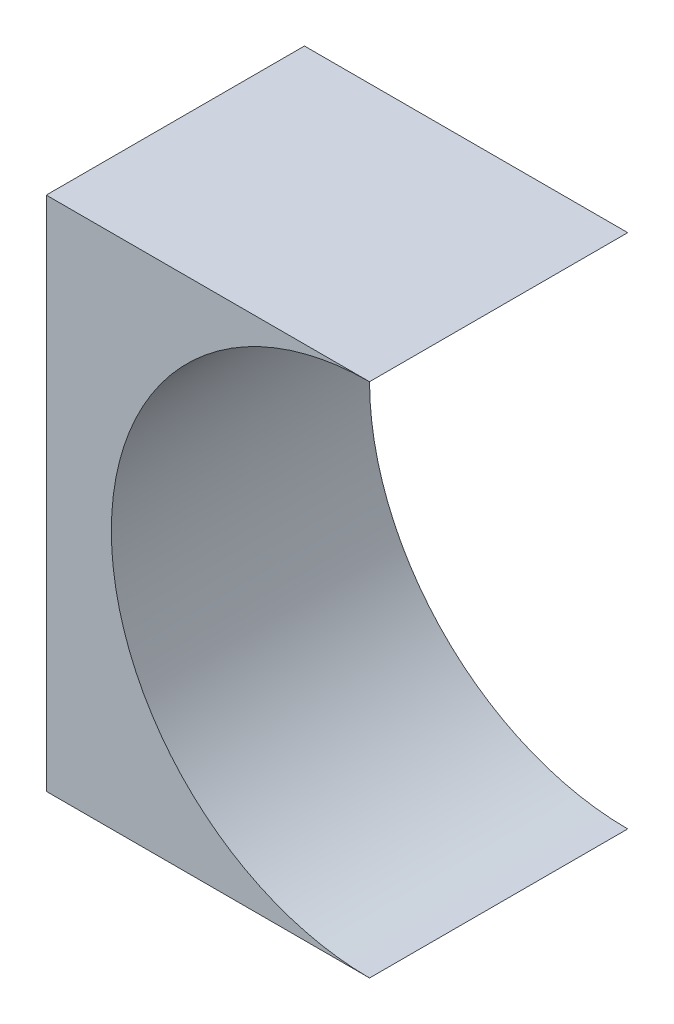
ISO-10303-21;
HEADER;
FILE_DESCRIPTION(('STEP AP214'),'2;1');
FILE_NAME('part.step','',(''),(''),'','','');
FILE_SCHEMA(('AUTOMOTIVE_DESIGN { 1 0 10303 214 1 1 1 1 }'));
ENDSEC;
DATA;
#1=APPLICATION_CONTEXT('core data for automotive mechanical design processes');
#2=APPLICATION_PROTOCOL_DEFINITION('international standard','automotive_design',2000,#1);
#3=PRODUCT_CONTEXT('',#1,'mechanical');
#4=PRODUCT('Part','Part','',(#3));
#5=PRODUCT_RELATED_PRODUCT_CATEGORY('part','',(#4));
#6=PRODUCT_DEFINITION_FORMATION('','',#4);
#7=PRODUCT_DEFINITION_CONTEXT('part definition',#1,'design');
#8=PRODUCT_DEFINITION('design','',#6,#7);
#9=PRODUCT_DEFINITION_SHAPE('','',#8);
#10=(LENGTH_UNIT() NAMED_UNIT(*) SI_UNIT(.MILLI.,.METRE.));
#11=(NAMED_UNIT(*) PLANE_ANGLE_UNIT() SI_UNIT($,.RADIAN.));
#12=(NAMED_UNIT(*) SI_UNIT($,.STERADIAN.) SOLID_ANGLE_UNIT());
#13=UNCERTAINTY_MEASURE_WITH_UNIT(LENGTH_MEASURE(1.E-05),#10,'distance_accuracy_value','');
#14=(GEOMETRIC_REPRESENTATION_CONTEXT(3) GLOBAL_UNCERTAINTY_ASSIGNED_CONTEXT((#13)) GLOBAL_UNIT_ASSIGNED_CONTEXT((#10,
#11,#12)) REPRESENTATION_CONTEXT('',''));
#15=CARTESIAN_POINT('',(0.,0.,0.));
#16=DIRECTION('',(0.,0.,1.));
#17=DIRECTION('',(1.,0.,0.));
#18=AXIS2_PLACEMENT_3D('',#15,#16,#17);
#19=CARTESIAN_POINT('',(42.5923208457728,-12.1016480728013,0.));
#20=DIRECTION('',(0.,0.,1.));
#21=DIRECTION('',(1.,0.,0.));
#22=AXIS2_PLACEMENT_3D('',#19,#20,#21);
#23=PLANE('',#22);
#24=DIRECTION('',(1.,0.,0.));
#25=VECTOR('',#24,1.);
#26=CARTESIAN_POINT('',(7.87350045627635,-42.1016480728013,0.));
#27=LINE('',#26,#25);
#28=CARTESIAN_POINT('',(23.8111412352692,-42.1016480728013,0.));
#29=VERTEX_POINT('',#28);
#30=CARTESIAN_POINT('',(61.3735004562764,-42.1016480728013,0.));
#31=VERTEX_POINT('',#30);
#32=EDGE_CURVE('E20',#29,#31,#27,.T.);
#33=ORIENTED_EDGE('',*,*,#32,.F.);
#34=DIRECTION('',(0.,-1.,0.));
#35=VECTOR('',#34,1.);
#36=CARTESIAN_POINT('',(23.8111412352692,17.8983519271987,0.));
#37=LINE('',#36,#35);
#38=CARTESIAN_POINT('',(23.8111412352692,17.8983519271987,0.));
#39=VERTEX_POINT('',#38);
#40=EDGE_CURVE('E92',#39,#29,#37,.T.);
#41=ORIENTED_EDGE('',*,*,#40,.F.);
#42=DIRECTION('',(-1.,0.,0.));
#43=VECTOR('',#42,1.);
#44=CARTESIAN_POINT('',(61.3735004562764,17.8983519271987,0.));
#45=LINE('',#44,#43);
#46=CARTESIAN_POINT('',(61.3735004562764,17.8983519271987,0.));
#47=VERTEX_POINT('',#46);
#48=EDGE_CURVE('E72',#47,#39,#45,.T.);
#49=ORIENTED_EDGE('',*,*,#48,.F.);
#50=CARTESIAN_POINT('',(61.3735004562764,-12.1016480728013,0.));
#51=DIRECTION('',(0.,0.,-1.));
#52=DIRECTION('',(-1.,0.,0.));
#53=AXIS2_PLACEMENT_3D('',#50,#51,#52);
#54=CIRCLE('',#53,30.);
#55=EDGE_CURVE('E106',#31,#47,#54,.T.);
#56=ORIENTED_EDGE('',*,*,#55,.F.);
#57=EDGE_LOOP('',(#33,#41,#49,#56));
#58=FACE_BOUND('',#57,.T.);
#59=ADVANCED_FACE('F17',(#58),#23,.F.);
#60=CARTESIAN_POINT('',(42.5923208457728,-12.1016480728013,30.));
#61=DIRECTION('',(0.,0.,1.));
#62=DIRECTION('',(1.,0.,0.));
#63=AXIS2_PLACEMENT_3D('',#60,#61,#62);
#64=PLANE('',#63);
#65=DIRECTION('',(1.,0.,0.));
#66=VECTOR('',#65,1.);
#67=CARTESIAN_POINT('',(7.87350045627635,-42.1016480728013,30.));
#68=LINE('',#67,#66);
#69=CARTESIAN_POINT('',(23.8111412352692,-42.1016480728013,30.));
#70=VERTEX_POINT('',#69);
#71=CARTESIAN_POINT('',(61.3735004562764,-42.1016480728013,30.));
#72=VERTEX_POINT('',#71);
#73=EDGE_CURVE('E11',#70,#72,#68,.T.);
#74=ORIENTED_EDGE('',*,*,#73,.T.);
#75=CARTESIAN_POINT('',(61.3735004562764,-12.1016480728013,30.));
#76=DIRECTION('',(0.,0.,-1.));
#77=DIRECTION('',(-1.,0.,0.));
#78=AXIS2_PLACEMENT_3D('',#75,#76,#77);
#79=CIRCLE('',#78,30.);
#80=CARTESIAN_POINT('',(61.3735004562764,17.8983519271987,30.));
#81=VERTEX_POINT('',#80);
#82=EDGE_CURVE('E68',#72,#81,#79,.T.);
#83=ORIENTED_EDGE('',*,*,#82,.T.);
#84=DIRECTION('',(-1.,0.,0.));
#85=VECTOR('',#84,1.);
#86=CARTESIAN_POINT('',(61.3735004562764,17.8983519271987,30.));
#87=LINE('',#86,#85);
#88=CARTESIAN_POINT('',(23.8111412352692,17.8983519271987,30.));
#89=VERTEX_POINT('',#88);
#90=EDGE_CURVE('E61',#81,#89,#87,.T.);
#91=ORIENTED_EDGE('',*,*,#90,.T.);
#92=DIRECTION('',(0.,-1.,0.));
#93=VECTOR('',#92,1.);
#94=CARTESIAN_POINT('',(23.8111412352692,17.8983519271987,30.));
#95=LINE('',#94,#93);
#96=EDGE_CURVE('E65',#89,#70,#95,.T.);
#97=ORIENTED_EDGE('',*,*,#96,.T.);
#98=EDGE_LOOP('',(#74,#83,#91,#97));
#99=FACE_BOUND('',#98,.T.);
#100=ADVANCED_FACE('F64',(#99),#64,.T.);
#101=CARTESIAN_POINT('',(23.8111412352692,-42.1016480728013,0.));
#102=DIRECTION('',(0.,-1.,0.));
#103=DIRECTION('',(0.,0.,-1.));
#104=AXIS2_PLACEMENT_3D('',#101,#102,#103);
#105=PLANE('',#104);
#106=ORIENTED_EDGE('',*,*,#32,.T.);
#107=DIRECTION('',(0.,0.,1.));
#108=VECTOR('',#107,1.);
#109=CARTESIAN_POINT('',(61.3735004562764,-42.1016480728013,0.));
#110=LINE('',#109,#108);
#111=EDGE_CURVE('E97',#31,#72,#110,.T.);
#112=ORIENTED_EDGE('',*,*,#111,.T.);
#113=ORIENTED_EDGE('',*,*,#73,.F.);
#114=DIRECTION('',(0.,0.,1.));
#115=VECTOR('',#114,1.);
#116=CARTESIAN_POINT('',(23.8111412352692,-42.1016480728013,0.));
#117=LINE('',#116,#115);
#118=EDGE_CURVE('E86',#29,#70,#117,.T.);
#119=ORIENTED_EDGE('',*,*,#118,.F.);
#120=EDGE_LOOP('',(#106,#112,#113,#119));
#121=FACE_BOUND('',#120,.T.);
#122=ADVANCED_FACE('F172',(#121),#105,.T.);
#123=CARTESIAN_POINT('',(61.3735004562764,-12.1016480728013,0.));
#124=DIRECTION('',(0.,0.,1.));
#125=DIRECTION('',(-1.,0.,0.));
#126=AXIS2_PLACEMENT_3D('',#123,#124,#125);
#127=CYLINDRICAL_SURFACE('',#126,30.);
#128=ORIENTED_EDGE('',*,*,#55,.T.);
#129=DIRECTION('',(0.,0.,1.));
#130=VECTOR('',#129,1.);
#131=CARTESIAN_POINT('',(61.3735004562764,17.8983519271987,0.));
#132=LINE('',#131,#130);
#133=EDGE_CURVE('E73',#47,#81,#132,.T.);
#134=ORIENTED_EDGE('',*,*,#133,.T.);
#135=ORIENTED_EDGE('',*,*,#82,.F.);
#136=ORIENTED_EDGE('',*,*,#111,.F.);
#137=EDGE_LOOP('',(#128,#134,#135,#136));
#138=FACE_BOUND('',#137,.T.);
#139=ADVANCED_FACE('F165',(#138),#127,.F.);
#140=CARTESIAN_POINT('',(61.3735004562764,17.8983519271987,0.));
#141=DIRECTION('',(0.,1.,0.));
#142=DIRECTION('',(1.,0.,0.));
#143=AXIS2_PLACEMENT_3D('',#140,#141,#142);
#144=PLANE('',#143);
#145=ORIENTED_EDGE('',*,*,#48,.T.);
#146=DIRECTION('',(0.,0.,1.));
#147=VECTOR('',#146,1.);
#148=CARTESIAN_POINT('',(23.8111412352692,17.8983519271987,0.));
#149=LINE('',#148,#147);
#150=EDGE_CURVE('E77',#39,#89,#149,.T.);
#151=ORIENTED_EDGE('',*,*,#150,.T.);
#152=ORIENTED_EDGE('',*,*,#90,.F.);
#153=ORIENTED_EDGE('',*,*,#133,.F.);
#154=EDGE_LOOP('',(#145,#151,#152,#153));
#155=FACE_BOUND('',#154,.T.);
#156=ADVANCED_FACE('F78',(#155),#144,.T.);
#157=CARTESIAN_POINT('',(23.8111412352692,17.8983519271987,0.));
#158=DIRECTION('',(-1.,0.,0.));
#159=DIRECTION('',(0.,0.,1.));
#160=AXIS2_PLACEMENT_3D('',#157,#158,#159);
#161=PLANE('',#160);
#162=ORIENTED_EDGE('',*,*,#40,.T.);
#163=ORIENTED_EDGE('',*,*,#118,.T.);
#164=ORIENTED_EDGE('',*,*,#96,.F.);
#165=ORIENTED_EDGE('',*,*,#150,.F.);
#166=EDGE_LOOP('',(#162,#163,#164,#165));
#167=FACE_BOUND('',#166,.T.);
#168=ADVANCED_FACE('F88',(#167),#161,.T.);
#169=CLOSED_SHELL('',(#59,#100,#122,#139,#156,#168));
#170=MANIFOLD_SOLID_BREP('B1',#169);
#171=ADVANCED_BREP_SHAPE_REPRESENTATION('',(#18,#170),#14);
#172=SHAPE_DEFINITION_REPRESENTATION(#9,#171);
ENDSEC;
END-ISO-10303-21;
